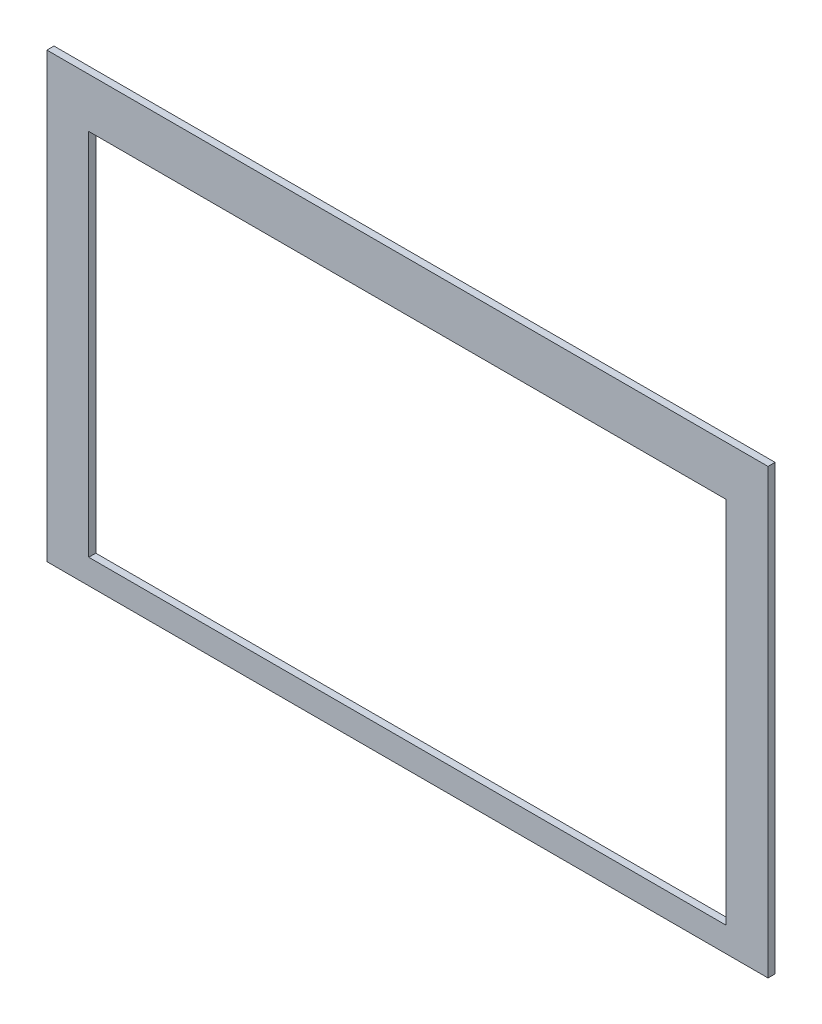
ISO-10303-21;
HEADER;
FILE_DESCRIPTION(('STEP AP214'),'2;1');
FILE_NAME('part.step','',(''),(''),'','','');
FILE_SCHEMA(('AUTOMOTIVE_DESIGN { 1 0 10303 214 1 1 1 1 }'));
ENDSEC;
DATA;
#1=APPLICATION_CONTEXT('core data for automotive mechanical design processes');
#2=APPLICATION_PROTOCOL_DEFINITION('international standard','automotive_design',2000,#1);
#3=PRODUCT_CONTEXT('',#1,'mechanical');
#4=PRODUCT('Part','Part','',(#3));
#5=PRODUCT_RELATED_PRODUCT_CATEGORY('part','',(#4));
#6=PRODUCT_DEFINITION_FORMATION('','',#4);
#7=PRODUCT_DEFINITION_CONTEXT('part definition',#1,'design');
#8=PRODUCT_DEFINITION('design','',#6,#7);
#9=PRODUCT_DEFINITION_SHAPE('','',#8);
#10=(LENGTH_UNIT() NAMED_UNIT(*) SI_UNIT(.MILLI.,.METRE.));
#11=(NAMED_UNIT(*) PLANE_ANGLE_UNIT() SI_UNIT($,.RADIAN.));
#12=(NAMED_UNIT(*) SI_UNIT($,.STERADIAN.) SOLID_ANGLE_UNIT());
#13=UNCERTAINTY_MEASURE_WITH_UNIT(LENGTH_MEASURE(1.E-05),#10,'distance_accuracy_value','');
#14=(GEOMETRIC_REPRESENTATION_CONTEXT(3) GLOBAL_UNCERTAINTY_ASSIGNED_CONTEXT((#13)) GLOBAL_UNIT_ASSIGNED_CONTEXT((#10,
#11,#12)) REPRESENTATION_CONTEXT('',''));
#15=CARTESIAN_POINT('',(0.,0.,0.));
#16=DIRECTION('',(0.,0.,1.));
#17=DIRECTION('',(1.,0.,0.));
#18=AXIS2_PLACEMENT_3D('',#15,#16,#17);
#19=CARTESIAN_POINT('',(750.911763317867,514.606733479798,6.));
#20=DIRECTION('',(1.,0.,0.));
#21=DIRECTION('',(0.,0.,-1.));
#22=AXIS2_PLACEMENT_3D('',#19,#20,#21);
#23=PLANE('',#22);
#24=DIRECTION('',(0.,-1.,0.));
#25=VECTOR('',#24,1.);
#26=CARTESIAN_POINT('',(750.911763317867,514.606733479798,0.));
#27=LINE('',#26,#25);
#28=CARTESIAN_POINT('',(750.911763317867,514.606733479798,0.));
#29=VERTEX_POINT('',#28);
#30=CARTESIAN_POINT('',(750.911763317867,138.606733479798,0.));
#31=VERTEX_POINT('',#30);
#32=EDGE_CURVE('E127',#29,#31,#27,.T.);
#33=ORIENTED_EDGE('',*,*,#32,.T.);
#34=DIRECTION('',(0.,0.,-1.));
#35=VECTOR('',#34,1.);
#36=CARTESIAN_POINT('',(750.911763317867,138.606733479798,6.));
#37=LINE('',#36,#35);
#38=CARTESIAN_POINT('',(750.911763317867,138.606733479798,6.));
#39=VERTEX_POINT('',#38);
#40=EDGE_CURVE('E11',#39,#31,#37,.T.);
#41=ORIENTED_EDGE('',*,*,#40,.F.);
#42=DIRECTION('',(0.,-1.,0.));
#43=VECTOR('',#42,1.);
#44=CARTESIAN_POINT('',(750.911763317867,514.606733479798,6.));
#45=LINE('',#44,#43);
#46=CARTESIAN_POINT('',(750.911763317867,514.606733479798,6.));
#47=VERTEX_POINT('',#46);
#48=EDGE_CURVE('E129',#47,#39,#45,.T.);
#49=ORIENTED_EDGE('',*,*,#48,.F.);
#50=DIRECTION('',(0.,0.,-1.));
#51=VECTOR('',#50,1.);
#52=CARTESIAN_POINT('',(750.911763317867,514.606733479798,6.));
#53=LINE('',#52,#51);
#54=EDGE_CURVE('E139',#47,#29,#53,.T.);
#55=ORIENTED_EDGE('',*,*,#54,.T.);
#56=EDGE_LOOP('',(#33,#41,#49,#55));
#57=FACE_BOUND('',#56,.T.);
#58=ADVANCED_FACE('F33',(#57),#23,.F.);
#59=CARTESIAN_POINT('',(750.911763317867,138.606733479798,6.));
#60=DIRECTION('',(0.,1.,0.));
#61=DIRECTION('',(0.,0.,1.));
#62=AXIS2_PLACEMENT_3D('',#59,#60,#61);
#63=PLANE('',#62);
#64=DIRECTION('',(1.,0.,0.));
#65=VECTOR('',#64,1.);
#66=CARTESIAN_POINT('',(750.911763317867,138.606733479798,0.));
#67=LINE('',#66,#65);
#68=CARTESIAN_POINT('',(1362.91176331787,138.606733479798,0.));
#69=VERTEX_POINT('',#68);
#70=EDGE_CURVE('E142',#31,#69,#67,.T.);
#71=ORIENTED_EDGE('',*,*,#70,.T.);
#72=DIRECTION('',(0.,0.,-1.));
#73=VECTOR('',#72,1.);
#74=CARTESIAN_POINT('',(1362.91176331787,138.606733479798,6.));
#75=LINE('',#74,#73);
#76=CARTESIAN_POINT('',(1362.91176331787,138.606733479798,6.));
#77=VERTEX_POINT('',#76);
#78=EDGE_CURVE('E40',#77,#69,#75,.T.);
#79=ORIENTED_EDGE('',*,*,#78,.F.);
#80=DIRECTION('',(1.,0.,0.));
#81=VECTOR('',#80,1.);
#82=CARTESIAN_POINT('',(750.911763317867,138.606733479798,6.));
#83=LINE('',#82,#81);
#84=EDGE_CURVE('E132',#39,#77,#83,.T.);
#85=ORIENTED_EDGE('',*,*,#84,.F.);
#86=ORIENTED_EDGE('',*,*,#40,.T.);
#87=EDGE_LOOP('',(#71,#79,#85,#86));
#88=FACE_BOUND('',#87,.T.);
#89=ADVANCED_FACE('F170',(#88),#63,.F.);
#90=CARTESIAN_POINT('',(1362.91176331787,514.606733479798,6.));
#91=DIRECTION('',(-1.,0.,0.));
#92=DIRECTION('',(0.,0.,1.));
#93=AXIS2_PLACEMENT_3D('',#90,#91,#92);
#94=PLANE('',#93);
#95=DIRECTION('',(0.,1.,0.));
#96=VECTOR('',#95,1.);
#97=CARTESIAN_POINT('',(1362.91176331787,514.606733479798,0.));
#98=LINE('',#97,#96);
#99=CARTESIAN_POINT('',(1362.91176331787,514.606733479798,0.));
#100=VERTEX_POINT('',#99);
#101=EDGE_CURVE('E144',#69,#100,#98,.T.);
#102=ORIENTED_EDGE('',*,*,#101,.T.);
#103=DIRECTION('',(0.,0.,-1.));
#104=VECTOR('',#103,1.);
#105=CARTESIAN_POINT('',(1362.91176331787,514.606733479798,6.));
#106=LINE('',#105,#104);
#107=CARTESIAN_POINT('',(1362.91176331787,514.606733479798,6.));
#108=VERTEX_POINT('',#107);
#109=EDGE_CURVE('E149',#108,#100,#106,.T.);
#110=ORIENTED_EDGE('',*,*,#109,.F.);
#111=DIRECTION('',(0.,1.,0.));
#112=VECTOR('',#111,1.);
#113=CARTESIAN_POINT('',(1362.91176331787,514.606733479798,6.));
#114=LINE('',#113,#112);
#115=EDGE_CURVE('E135',#77,#108,#114,.T.);
#116=ORIENTED_EDGE('',*,*,#115,.F.);
#117=ORIENTED_EDGE('',*,*,#78,.T.);
#118=EDGE_LOOP('',(#102,#110,#116,#117));
#119=FACE_BOUND('',#118,.T.);
#120=ADVANCED_FACE('F156',(#119),#94,.F.);
#121=CARTESIAN_POINT('',(750.911763317867,514.606733479798,6.));
#122=DIRECTION('',(0.,-1.,0.));
#123=DIRECTION('',(0.,0.,-1.));
#124=AXIS2_PLACEMENT_3D('',#121,#122,#123);
#125=PLANE('',#124);
#126=DIRECTION('',(-1.,0.,0.));
#127=VECTOR('',#126,1.);
#128=CARTESIAN_POINT('',(750.911763317867,514.606733479798,0.));
#129=LINE('',#128,#127);
#130=EDGE_CURVE('E133',#100,#29,#129,.T.);
#131=ORIENTED_EDGE('',*,*,#130,.T.);
#132=ORIENTED_EDGE('',*,*,#54,.F.);
#133=DIRECTION('',(-1.,0.,0.));
#134=VECTOR('',#133,1.);
#135=CARTESIAN_POINT('',(750.911763317867,514.606733479798,6.));
#136=LINE('',#135,#134);
#137=EDGE_CURVE('E137',#108,#47,#136,.T.);
#138=ORIENTED_EDGE('',*,*,#137,.F.);
#139=ORIENTED_EDGE('',*,*,#109,.T.);
#140=EDGE_LOOP('',(#131,#132,#138,#139));
#141=FACE_BOUND('',#140,.T.);
#142=ADVANCED_FACE('F165',(#141),#125,.F.);
#143=CARTESIAN_POINT('',(0.,0.,6.));
#144=DIRECTION('',(0.,0.,1.));
#145=DIRECTION('',(1.,0.,0.));
#146=AXIS2_PLACEMENT_3D('',#143,#144,#145);
#147=PLANE('',#146);
#148=DIRECTION('',(0.,-1.,0.));
#149=VECTOR('',#148,1.);
#150=CARTESIAN_POINT('',(786.411763317867,472.606733479798,6.));
#151=LINE('',#150,#149);
#152=CARTESIAN_POINT('',(786.411763317867,472.606733479798,6.));
#153=VERTEX_POINT('',#152);
#154=CARTESIAN_POINT('',(786.411763317867,159.606733479798,6.));
#155=VERTEX_POINT('',#154);
#156=EDGE_CURVE('E47',#153,#155,#151,.T.);
#157=ORIENTED_EDGE('',*,*,#156,.F.);
#158=DIRECTION('',(-1.,0.,0.));
#159=VECTOR('',#158,1.);
#160=CARTESIAN_POINT('',(786.411763317867,472.606733479798,6.));
#161=LINE('',#160,#159);
#162=CARTESIAN_POINT('',(1327.41176331787,472.606733479798,6.));
#163=VERTEX_POINT('',#162);
#164=EDGE_CURVE('E116',#163,#153,#161,.T.);
#165=ORIENTED_EDGE('',*,*,#164,.F.);
#166=DIRECTION('',(0.,1.,0.));
#167=VECTOR('',#166,1.);
#168=CARTESIAN_POINT('',(1327.41176331787,472.606733479798,6.));
#169=LINE('',#168,#167);
#170=CARTESIAN_POINT('',(1327.41176331787,159.606733479798,6.));
#171=VERTEX_POINT('',#170);
#172=EDGE_CURVE('E100',#171,#163,#169,.T.);
#173=ORIENTED_EDGE('',*,*,#172,.F.);
#174=DIRECTION('',(1.,0.,0.));
#175=VECTOR('',#174,1.);
#176=CARTESIAN_POINT('',(786.411763317867,159.606733479798,6.));
#177=LINE('',#176,#175);
#178=EDGE_CURVE('E109',#155,#171,#177,.T.);
#179=ORIENTED_EDGE('',*,*,#178,.F.);
#180=EDGE_LOOP('',(#157,#165,#173,#179));
#181=FACE_BOUND('',#180,.T.);
#182=ORIENTED_EDGE('',*,*,#48,.T.);
#183=ORIENTED_EDGE('',*,*,#84,.T.);
#184=ORIENTED_EDGE('',*,*,#115,.T.);
#185=ORIENTED_EDGE('',*,*,#137,.T.);
#186=EDGE_LOOP('',(#182,#183,#184,#185));
#187=FACE_BOUND('',#186,.T.);
#188=ADVANCED_FACE('F113',(#181,#187),#147,.T.);
#189=CARTESIAN_POINT('',(0.,0.,0.));
#190=DIRECTION('',(0.,0.,1.));
#191=DIRECTION('',(1.,0.,0.));
#192=AXIS2_PLACEMENT_3D('',#189,#190,#191);
#193=PLANE('',#192);
#194=DIRECTION('',(1.,0.,0.));
#195=VECTOR('',#194,1.);
#196=CARTESIAN_POINT('',(786.411763317867,472.606733479798,0.));
#197=LINE('',#196,#195);
#198=CARTESIAN_POINT('',(786.411763317867,472.606733479798,0.));
#199=VERTEX_POINT('',#198);
#200=CARTESIAN_POINT('',(1327.41176331787,472.606733479798,0.));
#201=VERTEX_POINT('',#200);
#202=EDGE_CURVE('E199',#199,#201,#197,.T.);
#203=ORIENTED_EDGE('',*,*,#202,.F.);
#204=DIRECTION('',(0.,1.,0.));
#205=VECTOR('',#204,1.);
#206=CARTESIAN_POINT('',(786.411763317867,472.606733479798,0.));
#207=LINE('',#206,#205);
#208=CARTESIAN_POINT('',(786.411763317867,159.606733479798,0.));
#209=VERTEX_POINT('',#208);
#210=EDGE_CURVE('E128',#209,#199,#207,.T.);
#211=ORIENTED_EDGE('',*,*,#210,.F.);
#212=DIRECTION('',(-1.,0.,0.));
#213=VECTOR('',#212,1.);
#214=CARTESIAN_POINT('',(786.411763317867,159.606733479798,0.));
#215=LINE('',#214,#213);
#216=CARTESIAN_POINT('',(1327.41176331787,159.606733479798,0.));
#217=VERTEX_POINT('',#216);
#218=EDGE_CURVE('E125',#217,#209,#215,.T.);
#219=ORIENTED_EDGE('',*,*,#218,.F.);
#220=DIRECTION('',(0.,-1.,0.));
#221=VECTOR('',#220,1.);
#222=CARTESIAN_POINT('',(1327.41176331787,472.606733479798,0.));
#223=LINE('',#222,#221);
#224=EDGE_CURVE('E103',#201,#217,#223,.T.);
#225=ORIENTED_EDGE('',*,*,#224,.F.);
#226=EDGE_LOOP('',(#203,#211,#219,#225));
#227=FACE_BOUND('',#226,.T.);
#228=ORIENTED_EDGE('',*,*,#32,.F.);
#229=ORIENTED_EDGE('',*,*,#130,.F.);
#230=ORIENTED_EDGE('',*,*,#101,.F.);
#231=ORIENTED_EDGE('',*,*,#70,.F.);
#232=EDGE_LOOP('',(#228,#229,#230,#231));
#233=FACE_BOUND('',#232,.T.);
#234=ADVANCED_FACE('F162',(#227,#233),#193,.F.);
#235=CARTESIAN_POINT('',(786.411763317867,472.606733479798,-625.01999968001));
#236=DIRECTION('',(-1.,0.,0.));
#237=DIRECTION('',(0.,0.,1.));
#238=AXIS2_PLACEMENT_3D('',#235,#236,#237);
#239=PLANE('',#238);
#240=ORIENTED_EDGE('',*,*,#210,.T.);
#241=DIRECTION('',(0.,0.,1.));
#242=VECTOR('',#241,1.);
#243=CARTESIAN_POINT('',(786.411763317867,472.606733479798,-625.01999968001));
#244=LINE('',#243,#242);
#245=EDGE_CURVE('E121',#199,#153,#244,.T.);
#246=ORIENTED_EDGE('',*,*,#245,.T.);
#247=ORIENTED_EDGE('',*,*,#156,.T.);
#248=DIRECTION('',(0.,0.,1.));
#249=VECTOR('',#248,1.);
#250=CARTESIAN_POINT('',(786.411763317867,159.606733479798,-625.01999968001));
#251=LINE('',#250,#249);
#252=EDGE_CURVE('E106',#209,#155,#251,.T.);
#253=ORIENTED_EDGE('',*,*,#252,.F.);
#254=EDGE_LOOP('',(#240,#246,#247,#253));
#255=FACE_BOUND('',#254,.T.);
#256=ADVANCED_FACE('F182',(#255),#239,.F.);
#257=CARTESIAN_POINT('',(786.411763317867,472.606733479798,-625.01999968001));
#258=DIRECTION('',(0.,1.,0.));
#259=DIRECTION('',(-1.,0.,0.));
#260=AXIS2_PLACEMENT_3D('',#257,#258,#259);
#261=PLANE('',#260);
#262=ORIENTED_EDGE('',*,*,#202,.T.);
#263=DIRECTION('',(0.,0.,1.));
#264=VECTOR('',#263,1.);
#265=CARTESIAN_POINT('',(1327.41176331787,472.606733479798,-625.01999968001));
#266=LINE('',#265,#264);
#267=EDGE_CURVE('E105',#201,#163,#266,.T.);
#268=ORIENTED_EDGE('',*,*,#267,.T.);
#269=ORIENTED_EDGE('',*,*,#164,.T.);
#270=ORIENTED_EDGE('',*,*,#245,.F.);
#271=EDGE_LOOP('',(#262,#268,#269,#270));
#272=FACE_BOUND('',#271,.T.);
#273=ADVANCED_FACE('F188',(#272),#261,.F.);
#274=CARTESIAN_POINT('',(1327.41176331787,472.606733479798,-625.01999968001));
#275=DIRECTION('',(1.,0.,0.));
#276=DIRECTION('',(0.,0.,-1.));
#277=AXIS2_PLACEMENT_3D('',#274,#275,#276);
#278=PLANE('',#277);
#279=ORIENTED_EDGE('',*,*,#224,.T.);
#280=DIRECTION('',(0.,0.,1.));
#281=VECTOR('',#280,1.);
#282=CARTESIAN_POINT('',(1327.41176331787,159.606733479798,-625.01999968001));
#283=LINE('',#282,#281);
#284=EDGE_CURVE('E55',#217,#171,#283,.T.);
#285=ORIENTED_EDGE('',*,*,#284,.T.);
#286=ORIENTED_EDGE('',*,*,#172,.T.);
#287=ORIENTED_EDGE('',*,*,#267,.F.);
#288=EDGE_LOOP('',(#279,#285,#286,#287));
#289=FACE_BOUND('',#288,.T.);
#290=ADVANCED_FACE('F97',(#289),#278,.F.);
#291=CARTESIAN_POINT('',(786.411763317867,159.606733479798,-625.01999968001));
#292=DIRECTION('',(0.,-1.,0.));
#293=DIRECTION('',(1.,0.,0.));
#294=AXIS2_PLACEMENT_3D('',#291,#292,#293);
#295=PLANE('',#294);
#296=ORIENTED_EDGE('',*,*,#218,.T.);
#297=ORIENTED_EDGE('',*,*,#252,.T.);
#298=ORIENTED_EDGE('',*,*,#178,.T.);
#299=ORIENTED_EDGE('',*,*,#284,.F.);
#300=EDGE_LOOP('',(#296,#297,#298,#299));
#301=FACE_BOUND('',#300,.T.);
#302=ADVANCED_FACE('F110',(#301),#295,.F.);
#303=CLOSED_SHELL('',(#58,#89,#120,#142,#188,#234,#256,#273,#290,#302));
#304=MANIFOLD_SOLID_BREP('B2',#303);
#305=ADVANCED_BREP_SHAPE_REPRESENTATION('',(#18,#304),#14);
#306=SHAPE_DEFINITION_REPRESENTATION(#9,#305);
ENDSEC;
END-ISO-10303-21;
